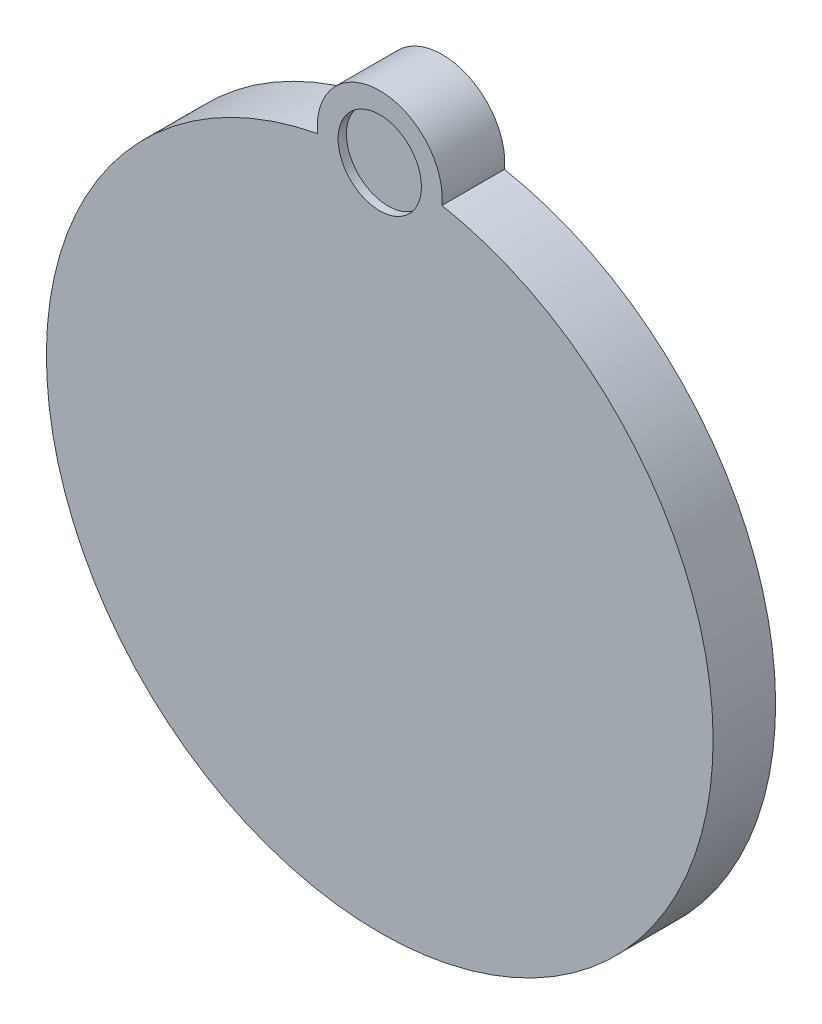
ISO-10303-21;
HEADER;
FILE_DESCRIPTION(('STEP AP214'),'2;1');
FILE_NAME('part.step','',(''),(''),'','','');
FILE_SCHEMA(('AUTOMOTIVE_DESIGN { 1 0 10303 214 1 1 1 1 }'));
ENDSEC;
DATA;
#1=APPLICATION_CONTEXT('core data for automotive mechanical design processes');
#2=APPLICATION_PROTOCOL_DEFINITION('international standard','automotive_design',2000,#1);
#3=PRODUCT_CONTEXT('',#1,'mechanical');
#4=PRODUCT('Part','Part','',(#3));
#5=PRODUCT_RELATED_PRODUCT_CATEGORY('part','',(#4));
#6=PRODUCT_DEFINITION_FORMATION('','',#4);
#7=PRODUCT_DEFINITION_CONTEXT('part definition',#1,'design');
#8=PRODUCT_DEFINITION('design','',#6,#7);
#9=PRODUCT_DEFINITION_SHAPE('','',#8);
#10=(LENGTH_UNIT() NAMED_UNIT(*) SI_UNIT(.MILLI.,.METRE.));
#11=(NAMED_UNIT(*) PLANE_ANGLE_UNIT() SI_UNIT($,.RADIAN.));
#12=(NAMED_UNIT(*) SI_UNIT($,.STERADIAN.) SOLID_ANGLE_UNIT());
#13=UNCERTAINTY_MEASURE_WITH_UNIT(LENGTH_MEASURE(1.E-05),#10,'distance_accuracy_value','');
#14=(GEOMETRIC_REPRESENTATION_CONTEXT(3) GLOBAL_UNCERTAINTY_ASSIGNED_CONTEXT((#13)) GLOBAL_UNIT_ASSIGNED_CONTEXT((#10,
#11,#12)) REPRESENTATION_CONTEXT('',''));
#15=CARTESIAN_POINT('',(0.,0.,0.));
#16=DIRECTION('',(0.,0.,1.));
#17=DIRECTION('',(1.,0.,0.));
#18=AXIS2_PLACEMENT_3D('',#15,#16,#17);
#19=CARTESIAN_POINT('',(0.,-80.,15.));
#20=DIRECTION('',(0.,0.,-1.));
#21=DIRECTION('',(-1.,0.,0.));
#22=AXIS2_PLACEMENT_3D('',#19,#20,#21);
#23=CYLINDRICAL_SURFACE('',#22,80.);
#24=CARTESIAN_POINT('',(0.,-80.,0.));
#25=DIRECTION('',(0.,0.,1.));
#26=DIRECTION('',(1.,0.,0.));
#27=AXIS2_PLACEMENT_3D('',#24,#25,#26);
#28=CIRCLE('',#27,80.);
#29=CARTESIAN_POINT('',(-14.9339365519444,-1.40625,0.));
#30=VERTEX_POINT('',#29);
#31=CARTESIAN_POINT('',(14.9339365519444,-1.40625000000001,0.));
#32=VERTEX_POINT('',#31);
#33=EDGE_CURVE('E64',#30,#32,#28,.T.);
#34=ORIENTED_EDGE('',*,*,#33,.T.);
#35=DIRECTION('',(0.,0.,-1.));
#36=VECTOR('',#35,1.);
#37=CARTESIAN_POINT('',(14.9339365519444,-1.40625000000001,15.));
#38=LINE('',#37,#36);
#39=CARTESIAN_POINT('',(14.9339365519444,-1.40625000000001,15.));
#40=VERTEX_POINT('',#39);
#41=EDGE_CURVE('E11',#40,#32,#38,.T.);
#42=ORIENTED_EDGE('',*,*,#41,.F.);
#43=CARTESIAN_POINT('',(0.,-80.,15.));
#44=DIRECTION('',(0.,0.,1.));
#45=DIRECTION('',(1.,0.,0.));
#46=AXIS2_PLACEMENT_3D('',#43,#44,#45);
#47=CIRCLE('',#46,80.);
#48=CARTESIAN_POINT('',(-14.9339365519444,-1.40625,15.));
#49=VERTEX_POINT('',#48);
#50=EDGE_CURVE('E63',#49,#40,#47,.T.);
#51=ORIENTED_EDGE('',*,*,#50,.F.);
#52=DIRECTION('',(0.,0.,-1.));
#53=VECTOR('',#52,1.);
#54=CARTESIAN_POINT('',(-14.9339365519444,-1.40625,15.));
#55=LINE('',#54,#53);
#56=EDGE_CURVE('E41',#49,#30,#55,.T.);
#57=ORIENTED_EDGE('',*,*,#56,.T.);
#58=EDGE_LOOP('',(#34,#42,#51,#57));
#59=FACE_BOUND('',#58,.T.);
#60=ADVANCED_FACE('F33',(#59),#23,.T.);
#61=CARTESIAN_POINT('',(0.,0.,15.));
#62=DIRECTION('',(0.,0.,-1.));
#63=DIRECTION('',(-1.,0.,0.));
#64=AXIS2_PLACEMENT_3D('',#61,#62,#63);
#65=CYLINDRICAL_SURFACE('',#64,15.);
#66=CARTESIAN_POINT('',(0.,0.,0.));
#67=DIRECTION('',(0.,0.,1.));
#68=DIRECTION('',(1.,0.,0.));
#69=AXIS2_PLACEMENT_3D('',#66,#67,#68);
#70=CIRCLE('',#69,15.);
#71=EDGE_CURVE('E56',#32,#30,#70,.T.);
#72=ORIENTED_EDGE('',*,*,#71,.T.);
#73=ORIENTED_EDGE('',*,*,#56,.F.);
#74=CARTESIAN_POINT('',(0.,0.,15.));
#75=DIRECTION('',(0.,0.,1.));
#76=DIRECTION('',(1.,0.,0.));
#77=AXIS2_PLACEMENT_3D('',#74,#75,#76);
#78=CIRCLE('',#77,15.);
#79=EDGE_CURVE('E48',#40,#49,#78,.T.);
#80=ORIENTED_EDGE('',*,*,#79,.F.);
#81=ORIENTED_EDGE('',*,*,#41,.T.);
#82=EDGE_LOOP('',(#72,#73,#80,#81));
#83=FACE_BOUND('',#82,.T.);
#84=ADVANCED_FACE('F59',(#83),#65,.T.);
#85=CARTESIAN_POINT('',(0.,0.,15.));
#86=DIRECTION('',(0.,0.,1.));
#87=DIRECTION('',(1.,0.,0.));
#88=AXIS2_PLACEMENT_3D('',#85,#86,#87);
#89=PLANE('',#88);
#90=CARTESIAN_POINT('',(0.,0.,15.));
#91=DIRECTION('',(0.,0.,1.));
#92=DIRECTION('',(1.,0.,0.));
#93=AXIS2_PLACEMENT_3D('',#90,#91,#92);
#94=CIRCLE('',#93,10.);
#95=CARTESIAN_POINT('',(10.,0.,15.));
#96=VERTEX_POINT('',#95);
#97=EDGE_CURVE('E71',#96,#96,#94,.T.);
#98=ORIENTED_EDGE('',*,*,#97,.F.);
#99=EDGE_LOOP('',(#98));
#100=FACE_BOUND('',#99,.T.);
#101=ORIENTED_EDGE('',*,*,#50,.T.);
#102=ORIENTED_EDGE('',*,*,#79,.T.);
#103=EDGE_LOOP('',(#101,#102));
#104=FACE_BOUND('',#103,.T.);
#105=ADVANCED_FACE('F81',(#100,#104),#89,.T.);
#106=CARTESIAN_POINT('',(0.,0.,0.));
#107=DIRECTION('',(0.,0.,1.));
#108=DIRECTION('',(1.,0.,0.));
#109=AXIS2_PLACEMENT_3D('',#106,#107,#108);
#110=PLANE('',#109);
#111=ORIENTED_EDGE('',*,*,#33,.F.);
#112=ORIENTED_EDGE('',*,*,#71,.F.);
#113=EDGE_LOOP('',(#111,#112));
#114=FACE_BOUND('',#113,.T.);
#115=ADVANCED_FACE('F67',(#114),#110,.F.);
#116=CARTESIAN_POINT('',(0.,0.,13.));
#117=DIRECTION('',(0.,0.,1.));
#118=DIRECTION('',(1.,0.,0.));
#119=AXIS2_PLACEMENT_3D('',#116,#117,#118);
#120=CYLINDRICAL_SURFACE('',#119,10.);
#121=CARTESIAN_POINT('',(0.,0.,13.));
#122=DIRECTION('',(0.,0.,1.));
#123=DIRECTION('',(1.,0.,0.));
#124=AXIS2_PLACEMENT_3D('',#121,#122,#123);
#125=CIRCLE('',#124,10.);
#126=CARTESIAN_POINT('',(10.,0.,13.));
#127=VERTEX_POINT('',#126);
#128=EDGE_CURVE('E68',#127,#127,#125,.T.);
#129=ORIENTED_EDGE('',*,*,#128,.F.);
#130=EDGE_LOOP('',(#129));
#131=FACE_BOUND('',#130,.T.);
#132=ORIENTED_EDGE('',*,*,#97,.T.);
#133=EDGE_LOOP('',(#132));
#134=FACE_BOUND('',#133,.T.);
#135=ADVANCED_FACE('F79',(#131,#134),#120,.F.);
#136=CARTESIAN_POINT('',(0.,0.,13.));
#137=DIRECTION('',(0.,0.,1.));
#138=DIRECTION('',(1.,0.,0.));
#139=AXIS2_PLACEMENT_3D('',#136,#137,#138);
#140=PLANE('',#139);
#141=ORIENTED_EDGE('',*,*,#128,.T.);
#142=EDGE_LOOP('',(#141));
#143=FACE_BOUND('',#142,.T.);
#144=ADVANCED_FACE('F111',(#143),#140,.T.);
#145=CLOSED_SHELL('',(#60,#84,#105,#115,#135,#144));
#146=MANIFOLD_SOLID_BREP('B2',#145);
#147=ADVANCED_BREP_SHAPE_REPRESENTATION('',(#18,#146),#14);
#148=SHAPE_DEFINITION_REPRESENTATION(#9,#147);
ENDSEC;
END-ISO-10303-21;
